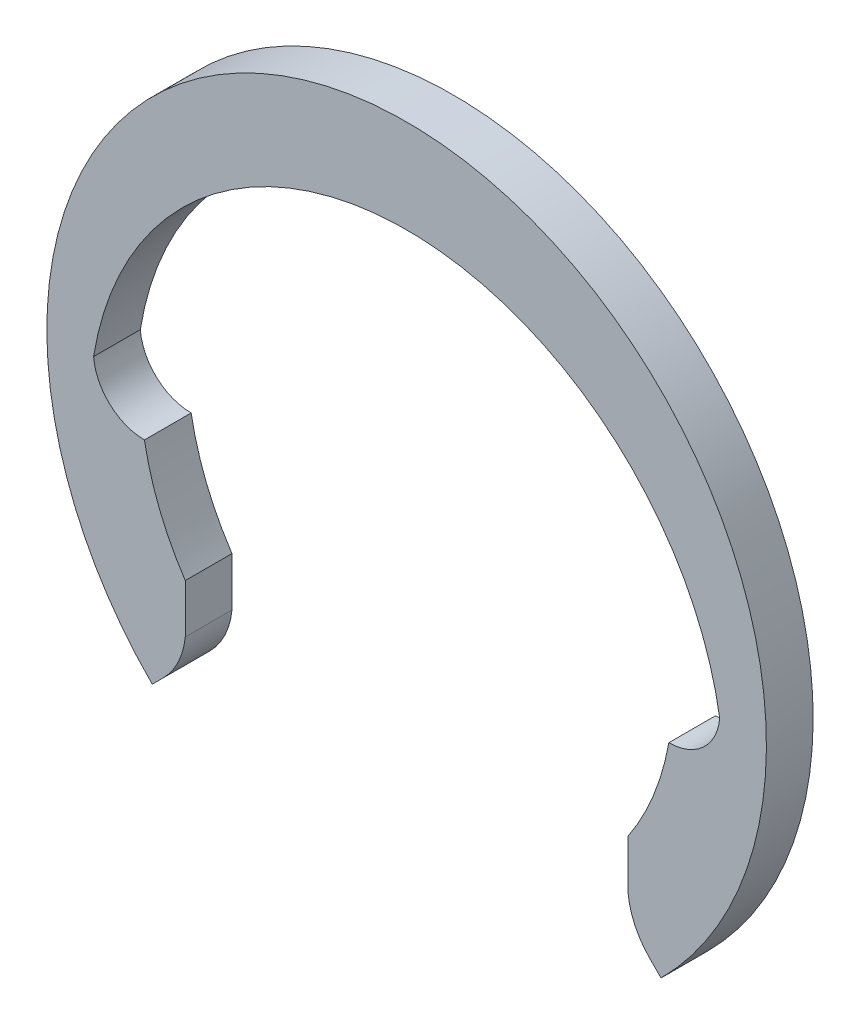
ISO-10303-21;
HEADER;
FILE_DESCRIPTION(('STEP AP214'),'2;1');
FILE_NAME('part.step','',(''),(''),'','','');
FILE_SCHEMA(('AUTOMOTIVE_DESIGN { 1 0 10303 214 1 1 1 1 }'));
ENDSEC;
DATA;
#1=APPLICATION_CONTEXT('core data for automotive mechanical design processes');
#2=APPLICATION_PROTOCOL_DEFINITION('international standard','automotive_design',2000,#1);
#3=PRODUCT_CONTEXT('',#1,'mechanical');
#4=PRODUCT('Part','Part','',(#3));
#5=PRODUCT_RELATED_PRODUCT_CATEGORY('part','',(#4));
#6=PRODUCT_DEFINITION_FORMATION('','',#4);
#7=PRODUCT_DEFINITION_CONTEXT('part definition',#1,'design');
#8=PRODUCT_DEFINITION('design','',#6,#7);
#9=PRODUCT_DEFINITION_SHAPE('','',#8);
#10=(LENGTH_UNIT() NAMED_UNIT(*) SI_UNIT(.MILLI.,.METRE.));
#11=(NAMED_UNIT(*) PLANE_ANGLE_UNIT() SI_UNIT($,.RADIAN.));
#12=(NAMED_UNIT(*) SI_UNIT($,.STERADIAN.) SOLID_ANGLE_UNIT());
#13=UNCERTAINTY_MEASURE_WITH_UNIT(LENGTH_MEASURE(1.E-05),#10,'distance_accuracy_value','');
#14=(GEOMETRIC_REPRESENTATION_CONTEXT(3) GLOBAL_UNCERTAINTY_ASSIGNED_CONTEXT((#13)) GLOBAL_UNIT_ASSIGNED_CONTEXT((#10,
#11,#12)) REPRESENTATION_CONTEXT('',''));
#15=CARTESIAN_POINT('',(0.,0.,0.));
#16=DIRECTION('',(0.,0.,1.));
#17=DIRECTION('',(1.,0.,0.));
#18=AXIS2_PLACEMENT_3D('',#15,#16,#17);
#19=CARTESIAN_POINT('',(-5.61159513863928,0.0923125711168253,1.));
#20=DIRECTION('',(0.,0.,-1.));
#21=DIRECTION('',(-1.,0.,0.));
#22=AXIS2_PLACEMENT_3D('',#19,#20,#21);
#23=CYLINDRICAL_SURFACE('',#22,1.09231257111682);
#24=CARTESIAN_POINT('',(-5.61159513863928,0.0923125711168253,0.));
#25=DIRECTION('',(0.,0.,-1.));
#26=DIRECTION('',(1.,0.,0.));
#27=AXIS2_PLACEMENT_3D('',#24,#25,#26);
#28=CIRCLE('',#27,1.09231257111682);
#29=CARTESIAN_POINT('',(-5.61159513863928,-0.999999999999996,0.));
#30=VERTEX_POINT('',#29);
#31=CARTESIAN_POINT('',(-6.7,0.,0.));
#32=VERTEX_POINT('',#31);
#33=EDGE_CURVE('E154',#30,#32,#28,.T.);
#34=ORIENTED_EDGE('',*,*,#33,.T.);
#35=DIRECTION('',(0.,0.,-1.));
#36=VECTOR('',#35,1.);
#37=CARTESIAN_POINT('',(-6.7,0.,1.));
#38=LINE('',#37,#36);
#39=CARTESIAN_POINT('',(-6.7,0.,1.));
#40=VERTEX_POINT('',#39);
#41=EDGE_CURVE('E11',#40,#32,#38,.T.);
#42=ORIENTED_EDGE('',*,*,#41,.F.);
#43=CARTESIAN_POINT('',(-5.61159513863928,0.0923125711168253,1.));
#44=DIRECTION('',(0.,0.,-1.));
#45=DIRECTION('',(1.,0.,0.));
#46=AXIS2_PLACEMENT_3D('',#43,#44,#45);
#47=CIRCLE('',#46,1.09231257111682);
#48=CARTESIAN_POINT('',(-5.61159513863928,-0.999999999999996,1.));
#49=VERTEX_POINT('',#48);
#50=EDGE_CURVE('E177',#49,#40,#47,.T.);
#51=ORIENTED_EDGE('',*,*,#50,.F.);
#52=DIRECTION('',(0.,0.,-1.));
#53=VECTOR('',#52,1.);
#54=CARTESIAN_POINT('',(-5.61159513863928,-0.999999999999996,1.));
#55=LINE('',#54,#53);
#56=EDGE_CURVE('E150',#49,#30,#55,.T.);
#57=ORIENTED_EDGE('',*,*,#56,.T.);
#58=EDGE_LOOP('',(#34,#42,#51,#57));
#59=FACE_BOUND('',#58,.T.);
#60=ADVANCED_FACE('F34',(#59),#23,.F.);
#61=CARTESIAN_POINT('',(0.,-1.08771929824562,1.));
#62=DIRECTION('',(0.,0.,-1.));
#63=DIRECTION('',(-1.,0.,0.));
#64=AXIS2_PLACEMENT_3D('',#61,#62,#63);
#65=CYLINDRICAL_SURFACE('',#64,6.78771929824562);
#66=CARTESIAN_POINT('',(0.,-1.08771929824562,0.));
#67=DIRECTION('',(0.,0.,-1.));
#68=DIRECTION('',(1.,0.,0.));
#69=AXIS2_PLACEMENT_3D('',#66,#67,#68);
#70=CIRCLE('',#69,6.78771929824562);
#71=CARTESIAN_POINT('',(6.7,0.,0.));
#72=VERTEX_POINT('',#71);
#73=EDGE_CURVE('E157',#32,#72,#70,.T.);
#74=ORIENTED_EDGE('',*,*,#73,.T.);
#75=DIRECTION('',(0.,0.,-1.));
#76=VECTOR('',#75,1.);
#77=CARTESIAN_POINT('',(6.7,0.,1.));
#78=LINE('',#77,#76);
#79=CARTESIAN_POINT('',(6.7,0.,1.));
#80=VERTEX_POINT('',#79);
#81=EDGE_CURVE('E42',#80,#72,#78,.T.);
#82=ORIENTED_EDGE('',*,*,#81,.F.);
#83=CARTESIAN_POINT('',(0.,-1.08771929824562,1.));
#84=DIRECTION('',(0.,0.,-1.));
#85=DIRECTION('',(1.,0.,0.));
#86=AXIS2_PLACEMENT_3D('',#83,#84,#85);
#87=CIRCLE('',#86,6.78771929824562);
#88=EDGE_CURVE('E104',#40,#80,#87,.T.);
#89=ORIENTED_EDGE('',*,*,#88,.F.);
#90=ORIENTED_EDGE('',*,*,#41,.T.);
#91=EDGE_LOOP('',(#74,#82,#89,#90));
#92=FACE_BOUND('',#91,.T.);
#93=ADVANCED_FACE('F254',(#92),#65,.F.);
#94=CARTESIAN_POINT('',(5.61159513863928,0.0923125711168266,1.));
#95=DIRECTION('',(0.,0.,-1.));
#96=DIRECTION('',(-1.,0.,0.));
#97=AXIS2_PLACEMENT_3D('',#94,#95,#96);
#98=CYLINDRICAL_SURFACE('',#97,1.09231257111682);
#99=CARTESIAN_POINT('',(5.61159513863928,0.0923125711168266,0.));
#100=DIRECTION('',(0.,0.,-1.));
#101=DIRECTION('',(-1.,0.,0.));
#102=AXIS2_PLACEMENT_3D('',#99,#100,#101);
#103=CIRCLE('',#102,1.09231257111682);
#104=CARTESIAN_POINT('',(5.61159513863928,-0.999999999999998,0.));
#105=VERTEX_POINT('',#104);
#106=EDGE_CURVE('E159',#72,#105,#103,.T.);
#107=ORIENTED_EDGE('',*,*,#106,.T.);
#108=DIRECTION('',(0.,0.,-1.));
#109=VECTOR('',#108,1.);
#110=CARTESIAN_POINT('',(5.61159513863928,-0.999999999999998,1.));
#111=LINE('',#110,#109);
#112=CARTESIAN_POINT('',(5.61159513863928,-0.999999999999998,1.));
#113=VERTEX_POINT('',#112);
#114=EDGE_CURVE('E196',#113,#105,#111,.T.);
#115=ORIENTED_EDGE('',*,*,#114,.F.);
#116=CARTESIAN_POINT('',(5.61159513863928,0.0923125711168266,1.));
#117=DIRECTION('',(0.,0.,-1.));
#118=DIRECTION('',(-1.,0.,0.));
#119=AXIS2_PLACEMENT_3D('',#116,#117,#118);
#120=CIRCLE('',#119,1.09231257111682);
#121=EDGE_CURVE('E204',#80,#113,#120,.T.);
#122=ORIENTED_EDGE('',*,*,#121,.F.);
#123=ORIENTED_EDGE('',*,*,#81,.T.);
#124=EDGE_LOOP('',(#107,#115,#122,#123));
#125=FACE_BOUND('',#124,.T.);
#126=ADVANCED_FACE('F202',(#125),#98,.F.);
#127=CARTESIAN_POINT('',(0.,0.,1.));
#128=DIRECTION('',(0.,0.,-1.));
#129=DIRECTION('',(-1.,0.,0.));
#130=AXIS2_PLACEMENT_3D('',#127,#128,#129);
#131=CYLINDRICAL_SURFACE('',#130,5.7);
#132=CARTESIAN_POINT('',(0.,0.,0.));
#133=DIRECTION('',(0.,0.,-1.));
#134=DIRECTION('',(-1.,0.,0.));
#135=AXIS2_PLACEMENT_3D('',#132,#133,#134);
#136=CIRCLE('',#135,5.7);
#137=CARTESIAN_POINT('',(4.73761543394988,-3.16938479834808,0.));
#138=VERTEX_POINT('',#137);
#139=EDGE_CURVE('E161',#105,#138,#136,.T.);
#140=ORIENTED_EDGE('',*,*,#139,.T.);
#141=DIRECTION('',(0.,0.,-1.));
#142=VECTOR('',#141,1.);
#143=CARTESIAN_POINT('',(4.73761543394988,-3.16938479834808,1.));
#144=LINE('',#143,#142);
#145=CARTESIAN_POINT('',(4.73761543394988,-3.16938479834808,1.));
#146=VERTEX_POINT('',#145);
#147=EDGE_CURVE('E193',#146,#138,#144,.T.);
#148=ORIENTED_EDGE('',*,*,#147,.F.);
#149=CARTESIAN_POINT('',(0.,0.,1.));
#150=DIRECTION('',(0.,0.,-1.));
#151=DIRECTION('',(-1.,0.,0.));
#152=AXIS2_PLACEMENT_3D('',#149,#150,#151);
#153=CIRCLE('',#152,5.7);
#154=EDGE_CURVE('E221',#113,#146,#153,.T.);
#155=ORIENTED_EDGE('',*,*,#154,.F.);
#156=ORIENTED_EDGE('',*,*,#114,.T.);
#157=EDGE_LOOP('',(#140,#148,#155,#156));
#158=FACE_BOUND('',#157,.T.);
#159=ADVANCED_FACE('F212',(#158),#131,.F.);
#160=CARTESIAN_POINT('',(4.73761543394988,-4.21487188874927,1.));
#161=DIRECTION('',(1.,0.,0.));
#162=DIRECTION('',(0.,0.,-1.));
#163=AXIS2_PLACEMENT_3D('',#160,#161,#162);
#164=PLANE('',#163);
#165=DIRECTION('',(0.,-1.,0.));
#166=VECTOR('',#165,1.);
#167=CARTESIAN_POINT('',(4.73761543394988,-4.21487188874927,0.));
#168=LINE('',#167,#166);
#169=CARTESIAN_POINT('',(4.73761543394988,-4.21487188874927,0.));
#170=VERTEX_POINT('',#169);
#171=EDGE_CURVE('E164',#138,#170,#168,.T.);
#172=ORIENTED_EDGE('',*,*,#171,.T.);
#173=DIRECTION('',(0.,0.,-1.));
#174=VECTOR('',#173,1.);
#175=CARTESIAN_POINT('',(4.73761543394988,-4.21487188874927,1.));
#176=LINE('',#175,#174);
#177=CARTESIAN_POINT('',(4.73761543394988,-4.21487188874927,1.));
#178=VERTEX_POINT('',#177);
#179=EDGE_CURVE('E190',#178,#170,#176,.T.);
#180=ORIENTED_EDGE('',*,*,#179,.F.);
#181=DIRECTION('',(0.,-1.,0.));
#182=VECTOR('',#181,1.);
#183=CARTESIAN_POINT('',(4.73761543394988,-3.69212834354868,1.));
#184=LINE('',#183,#182);
#185=EDGE_CURVE('E218',#146,#178,#184,.T.);
#186=ORIENTED_EDGE('',*,*,#185,.F.);
#187=ORIENTED_EDGE('',*,*,#147,.T.);
#188=EDGE_LOOP('',(#172,#180,#186,#187));
#189=FACE_BOUND('',#188,.T.);
#190=ADVANCED_FACE('F216',(#189),#164,.F.);
#191=CARTESIAN_POINT('',(6.3669037875031,-4.0511361219787,1.));
#192=DIRECTION('',(0.,0.,-1.));
#193=DIRECTION('',(-1.,0.,0.));
#194=AXIS2_PLACEMENT_3D('',#191,#192,#193);
#195=CYLINDRICAL_SURFACE('',#194,1.63749501994483);
#196=CARTESIAN_POINT('',(6.3669037875031,-4.0511361219787,0.));
#197=DIRECTION('',(0.,0.,1.));
#198=DIRECTION('',(1.,0.,0.));
#199=AXIS2_PLACEMENT_3D('',#196,#197,#198);
#200=CIRCLE('',#199,1.63749501994483);
#201=CARTESIAN_POINT('',(5.20901995474091,-5.20901995474089,0.));
#202=VERTEX_POINT('',#201);
#203=EDGE_CURVE('E166',#170,#202,#200,.T.);
#204=ORIENTED_EDGE('',*,*,#203,.T.);
#205=DIRECTION('',(0.,0.,-1.));
#206=VECTOR('',#205,1.);
#207=CARTESIAN_POINT('',(5.20901995474091,-5.20901995474089,1.));
#208=LINE('',#207,#206);
#209=CARTESIAN_POINT('',(5.20901995474091,-5.20901995474089,1.));
#210=VERTEX_POINT('',#209);
#211=EDGE_CURVE('E187',#210,#202,#208,.T.);
#212=ORIENTED_EDGE('',*,*,#211,.F.);
#213=CARTESIAN_POINT('',(6.3669037875031,-4.0511361219787,1.));
#214=DIRECTION('',(0.,0.,1.));
#215=DIRECTION('',(1.,0.,0.));
#216=AXIS2_PLACEMENT_3D('',#213,#214,#215);
#217=CIRCLE('',#216,1.63749501994483);
#218=EDGE_CURVE('E220',#178,#210,#217,.T.);
#219=ORIENTED_EDGE('',*,*,#218,.F.);
#220=ORIENTED_EDGE('',*,*,#179,.T.);
#221=EDGE_LOOP('',(#204,#212,#219,#220));
#222=FACE_BOUND('',#221,.T.);
#223=ADVANCED_FACE('F267',(#222),#195,.T.);
#224=CARTESIAN_POINT('',(5.20901995474091,-5.20901995474089,1.));
#225=DIRECTION('',(0.707106781186547,0.707106781186547,0.));
#226=DIRECTION('',(-0.707106781186548,0.707106781186548,0.));
#227=AXIS2_PLACEMENT_3D('',#224,#225,#226);
#228=PLANE('',#227);
#229=DIRECTION('',(0.707106781186547,-0.707106781186547,0.));
#230=VECTOR('',#229,1.);
#231=CARTESIAN_POINT('',(5.20901995474091,-5.20901995474089,0.));
#232=LINE('',#231,#230);
#233=CARTESIAN_POINT('',(5.44472221513642,-5.44472221513641,0.));
#234=VERTEX_POINT('',#233);
#235=EDGE_CURVE('E168',#202,#234,#232,.T.);
#236=ORIENTED_EDGE('',*,*,#235,.T.);
#237=DIRECTION('',(0.,0.,-1.));
#238=VECTOR('',#237,1.);
#239=CARTESIAN_POINT('',(5.44472221513642,-5.44472221513641,1.));
#240=LINE('',#239,#238);
#241=CARTESIAN_POINT('',(5.44472221513642,-5.44472221513641,1.));
#242=VERTEX_POINT('',#241);
#243=EDGE_CURVE('E184',#242,#234,#240,.T.);
#244=ORIENTED_EDGE('',*,*,#243,.F.);
#245=DIRECTION('',(0.707106781186547,-0.707106781186547,0.));
#246=VECTOR('',#245,1.);
#247=CARTESIAN_POINT('',(5.20901995474091,-5.20901995474089,1.));
#248=LINE('',#247,#246);
#249=EDGE_CURVE('E223',#210,#242,#248,.T.);
#250=ORIENTED_EDGE('',*,*,#249,.F.);
#251=ORIENTED_EDGE('',*,*,#211,.T.);
#252=EDGE_LOOP('',(#236,#244,#250,#251));
#253=FACE_BOUND('',#252,.T.);
#254=ADVANCED_FACE('F270',(#253),#228,.F.);
#255=CARTESIAN_POINT('',(0.,0.,1.));
#256=DIRECTION('',(0.,0.,-1.));
#257=DIRECTION('',(-1.,0.,0.));
#258=AXIS2_PLACEMENT_3D('',#255,#256,#257);
#259=CYLINDRICAL_SURFACE('',#258,7.7);
#260=CARTESIAN_POINT('',(0.,0.,0.));
#261=DIRECTION('',(0.,0.,1.));
#262=DIRECTION('',(1.,0.,0.));
#263=AXIS2_PLACEMENT_3D('',#260,#261,#262);
#264=CIRCLE('',#263,7.7);
#265=CARTESIAN_POINT('',(-5.44472221513642,-5.44472221513641,0.));
#266=VERTEX_POINT('',#265);
#267=EDGE_CURVE('E170',#234,#266,#264,.T.);
#268=ORIENTED_EDGE('',*,*,#267,.T.);
#269=DIRECTION('',(0.,0.,-1.));
#270=VECTOR('',#269,1.);
#271=CARTESIAN_POINT('',(-5.44472221513642,-5.44472221513641,1.));
#272=LINE('',#271,#270);
#273=CARTESIAN_POINT('',(-5.44472221513642,-5.44472221513641,1.));
#274=VERTEX_POINT('',#273);
#275=EDGE_CURVE('E181',#274,#266,#272,.T.);
#276=ORIENTED_EDGE('',*,*,#275,.F.);
#277=CARTESIAN_POINT('',(0.,0.,1.));
#278=DIRECTION('',(0.,0.,1.));
#279=DIRECTION('',(1.,0.,0.));
#280=AXIS2_PLACEMENT_3D('',#277,#278,#279);
#281=CIRCLE('',#280,7.7);
#282=EDGE_CURVE('E229',#242,#274,#281,.T.);
#283=ORIENTED_EDGE('',*,*,#282,.F.);
#284=ORIENTED_EDGE('',*,*,#243,.T.);
#285=EDGE_LOOP('',(#268,#276,#283,#284));
#286=FACE_BOUND('',#285,.T.);
#287=ADVANCED_FACE('F235',(#286),#259,.T.);
#288=CARTESIAN_POINT('',(-5.20901995474091,-5.20901995474089,1.));
#289=DIRECTION('',(-0.707106781186549,0.707106781186546,0.));
#290=DIRECTION('',(-0.707106781186546,-0.707106781186549,0.));
#291=AXIS2_PLACEMENT_3D('',#288,#289,#290);
#292=PLANE('',#291);
#293=DIRECTION('',(0.707106781186546,0.707106781186549,0.));
#294=VECTOR('',#293,1.);
#295=CARTESIAN_POINT('',(-5.20901995474091,-5.20901995474089,0.));
#296=LINE('',#295,#294);
#297=CARTESIAN_POINT('',(-5.20901995474091,-5.20901995474089,0.));
#298=VERTEX_POINT('',#297);
#299=EDGE_CURVE('E172',#266,#298,#296,.T.);
#300=ORIENTED_EDGE('',*,*,#299,.T.);
#301=DIRECTION('',(0.,0.,-1.));
#302=VECTOR('',#301,1.);
#303=CARTESIAN_POINT('',(-5.20901995474091,-5.20901995474089,1.));
#304=LINE('',#303,#302);
#305=CARTESIAN_POINT('',(-5.20901995474091,-5.20901995474089,1.));
#306=VERTEX_POINT('',#305);
#307=EDGE_CURVE('E145',#306,#298,#304,.T.);
#308=ORIENTED_EDGE('',*,*,#307,.F.);
#309=DIRECTION('',(0.707106781186546,0.707106781186549,0.));
#310=VECTOR('',#309,1.);
#311=CARTESIAN_POINT('',(-5.20901995474091,-5.20901995474089,1.));
#312=LINE('',#311,#310);
#313=EDGE_CURVE('E135',#274,#306,#312,.T.);
#314=ORIENTED_EDGE('',*,*,#313,.F.);
#315=ORIENTED_EDGE('',*,*,#275,.T.);
#316=EDGE_LOOP('',(#300,#308,#314,#315));
#317=FACE_BOUND('',#316,.T.);
#318=ADVANCED_FACE('F239',(#317),#292,.F.);
#319=CARTESIAN_POINT('',(-6.36690378750309,-4.05113612197871,1.));
#320=DIRECTION('',(0.,0.,-1.));
#321=DIRECTION('',(-1.,0.,0.));
#322=AXIS2_PLACEMENT_3D('',#319,#320,#321);
#323=CYLINDRICAL_SURFACE('',#322,1.63749501994482);
#324=CARTESIAN_POINT('',(-6.36690378750309,-4.05113612197871,0.));
#325=DIRECTION('',(0.,0.,1.));
#326=DIRECTION('',(-1.,0.,0.));
#327=AXIS2_PLACEMENT_3D('',#324,#325,#326);
#328=CIRCLE('',#327,1.63749501994482);
#329=CARTESIAN_POINT('',(-4.73761543394988,-4.21487188874927,0.));
#330=VERTEX_POINT('',#329);
#331=EDGE_CURVE('E144',#298,#330,#328,.T.);
#332=ORIENTED_EDGE('',*,*,#331,.T.);
#333=DIRECTION('',(0.,0.,-1.));
#334=VECTOR('',#333,1.);
#335=CARTESIAN_POINT('',(-4.73761543394988,-4.21487188874927,1.));
#336=LINE('',#335,#334);
#337=CARTESIAN_POINT('',(-4.73761543394988,-4.21487188874927,1.));
#338=VERTEX_POINT('',#337);
#339=EDGE_CURVE('E141',#338,#330,#336,.T.);
#340=ORIENTED_EDGE('',*,*,#339,.F.);
#341=CARTESIAN_POINT('',(-6.36690378750309,-4.05113612197871,1.));
#342=DIRECTION('',(0.,0.,1.));
#343=DIRECTION('',(-1.,0.,0.));
#344=AXIS2_PLACEMENT_3D('',#341,#342,#343);
#345=CIRCLE('',#344,1.63749501994482);
#346=EDGE_CURVE('E129',#306,#338,#345,.T.);
#347=ORIENTED_EDGE('',*,*,#346,.F.);
#348=ORIENTED_EDGE('',*,*,#307,.T.);
#349=EDGE_LOOP('',(#332,#340,#347,#348));
#350=FACE_BOUND('',#349,.T.);
#351=ADVANCED_FACE('F142',(#350),#323,.T.);
#352=CARTESIAN_POINT('',(-4.73761543394988,-3.69212834354868,1.));
#353=DIRECTION('',(-1.,0.,0.));
#354=DIRECTION('',(0.,0.,1.));
#355=AXIS2_PLACEMENT_3D('',#352,#353,#354);
#356=PLANE('',#355);
#357=DIRECTION('',(0.,1.,0.));
#358=VECTOR('',#357,1.);
#359=CARTESIAN_POINT('',(-4.73761543394988,-3.69212834354868,0.));
#360=LINE('',#359,#358);
#361=CARTESIAN_POINT('',(-4.73761543394988,-3.16938479834809,0.));
#362=VERTEX_POINT('',#361);
#363=EDGE_CURVE('E90',#330,#362,#360,.T.);
#364=ORIENTED_EDGE('',*,*,#363,.T.);
#365=DIRECTION('',(0.,0.,-1.));
#366=VECTOR('',#365,1.);
#367=CARTESIAN_POINT('',(-4.73761543394988,-3.16938479834809,1.));
#368=LINE('',#367,#366);
#369=CARTESIAN_POINT('',(-4.73761543394988,-3.16938479834809,1.));
#370=VERTEX_POINT('',#369);
#371=EDGE_CURVE('E146',#370,#362,#368,.T.);
#372=ORIENTED_EDGE('',*,*,#371,.F.);
#373=DIRECTION('',(0.,1.,0.));
#374=VECTOR('',#373,1.);
#375=CARTESIAN_POINT('',(-4.73761543394988,-4.21487188874927,1.));
#376=LINE('',#375,#374);
#377=EDGE_CURVE('E133',#338,#370,#376,.T.);
#378=ORIENTED_EDGE('',*,*,#377,.F.);
#379=ORIENTED_EDGE('',*,*,#339,.T.);
#380=EDGE_LOOP('',(#364,#372,#378,#379));
#381=FACE_BOUND('',#380,.T.);
#382=ADVANCED_FACE('F148',(#381),#356,.F.);
#383=CARTESIAN_POINT('',(0.,0.,1.));
#384=DIRECTION('',(0.,0.,-1.));
#385=DIRECTION('',(-1.,0.,0.));
#386=AXIS2_PLACEMENT_3D('',#383,#384,#385);
#387=CYLINDRICAL_SURFACE('',#386,5.7);
#388=CARTESIAN_POINT('',(0.,0.,0.));
#389=DIRECTION('',(0.,0.,-1.));
#390=DIRECTION('',(1.,0.,0.));
#391=AXIS2_PLACEMENT_3D('',#388,#389,#390);
#392=CIRCLE('',#391,5.7);
#393=EDGE_CURVE('E96',#362,#30,#392,.T.);
#394=ORIENTED_EDGE('',*,*,#393,.T.);
#395=ORIENTED_EDGE('',*,*,#56,.F.);
#396=CARTESIAN_POINT('',(0.,0.,1.));
#397=DIRECTION('',(0.,0.,-1.));
#398=DIRECTION('',(1.,0.,0.));
#399=AXIS2_PLACEMENT_3D('',#396,#397,#398);
#400=CIRCLE('',#399,5.7);
#401=EDGE_CURVE('E50',#370,#49,#400,.T.);
#402=ORIENTED_EDGE('',*,*,#401,.F.);
#403=ORIENTED_EDGE('',*,*,#371,.T.);
#404=EDGE_LOOP('',(#394,#395,#402,#403));
#405=FACE_BOUND('',#404,.T.);
#406=ADVANCED_FACE('F243',(#405),#387,.F.);
#407=CARTESIAN_POINT('',(-5.61159513863928,0.0923125711168253,1.));
#408=DIRECTION('',(0.,0.,1.));
#409=DIRECTION('',(1.,0.,0.));
#410=AXIS2_PLACEMENT_3D('',#407,#408,#409);
#411=PLANE('',#410);
#412=ORIENTED_EDGE('',*,*,#50,.T.);
#413=ORIENTED_EDGE('',*,*,#88,.T.);
#414=ORIENTED_EDGE('',*,*,#121,.T.);
#415=ORIENTED_EDGE('',*,*,#154,.T.);
#416=ORIENTED_EDGE('',*,*,#185,.T.);
#417=ORIENTED_EDGE('',*,*,#218,.T.);
#418=ORIENTED_EDGE('',*,*,#249,.T.);
#419=ORIENTED_EDGE('',*,*,#282,.T.);
#420=ORIENTED_EDGE('',*,*,#313,.T.);
#421=ORIENTED_EDGE('',*,*,#346,.T.);
#422=ORIENTED_EDGE('',*,*,#377,.T.);
#423=ORIENTED_EDGE('',*,*,#401,.T.);
#424=EDGE_LOOP('',(#412,#413,#414,#415,#416,#417,#418,#419,#420,#421,#422,#423));
#425=FACE_BOUND('',#424,.T.);
#426=ADVANCED_FACE('F131',(#425),#411,.T.);
#427=CARTESIAN_POINT('',(-5.61159513863928,0.0923125711168253,0.));
#428=DIRECTION('',(0.,0.,1.));
#429=DIRECTION('',(1.,0.,0.));
#430=AXIS2_PLACEMENT_3D('',#427,#428,#429);
#431=PLANE('',#430);
#432=ORIENTED_EDGE('',*,*,#33,.F.);
#433=ORIENTED_EDGE('',*,*,#393,.F.);
#434=ORIENTED_EDGE('',*,*,#363,.F.);
#435=ORIENTED_EDGE('',*,*,#331,.F.);
#436=ORIENTED_EDGE('',*,*,#299,.F.);
#437=ORIENTED_EDGE('',*,*,#267,.F.);
#438=ORIENTED_EDGE('',*,*,#235,.F.);
#439=ORIENTED_EDGE('',*,*,#203,.F.);
#440=ORIENTED_EDGE('',*,*,#171,.F.);
#441=ORIENTED_EDGE('',*,*,#139,.F.);
#442=ORIENTED_EDGE('',*,*,#106,.F.);
#443=ORIENTED_EDGE('',*,*,#73,.F.);
#444=EDGE_LOOP('',(#432,#433,#434,#435,#436,#437,#438,#439,#440,#441,#442,#443));
#445=FACE_BOUND('',#444,.T.);
#446=ADVANCED_FACE('F208',(#445),#431,.F.);
#447=CLOSED_SHELL('',(#60,#93,#126,#159,#190,#223,#254,#287,#318,#351,#382,#406,#426,#446));
#448=MANIFOLD_SOLID_BREP('B2',#447);
#449=ADVANCED_BREP_SHAPE_REPRESENTATION('',(#18,#448),#14);
#450=SHAPE_DEFINITION_REPRESENTATION(#9,#449);
ENDSEC;
END-ISO-10303-21;
